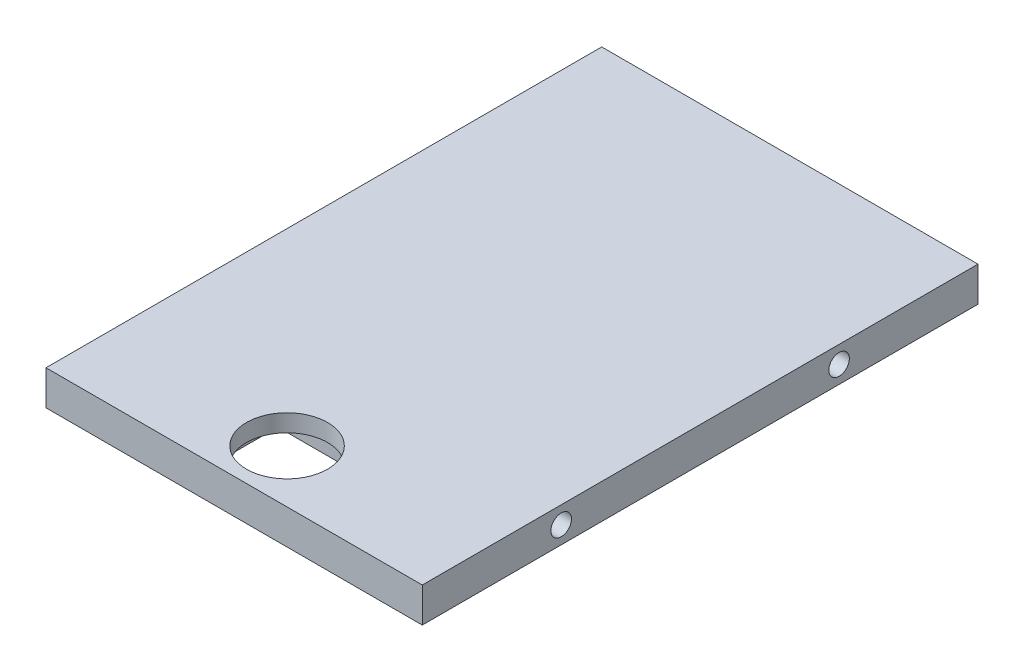
ISO-10303-21;
HEADER;
FILE_DESCRIPTION(('STEP AP214'),'2;1');
FILE_NAME('part.step','',(''),(''),'','','');
FILE_SCHEMA(('AUTOMOTIVE_DESIGN { 1 0 10303 214 1 1 1 1 }'));
ENDSEC;
DATA;
#1=APPLICATION_CONTEXT('core data for automotive mechanical design processes');
#2=APPLICATION_PROTOCOL_DEFINITION('international standard','automotive_design',2000,#1);
#3=PRODUCT_CONTEXT('',#1,'mechanical');
#4=PRODUCT('Part','Part','',(#3));
#5=PRODUCT_RELATED_PRODUCT_CATEGORY('part','',(#4));
#6=PRODUCT_DEFINITION_FORMATION('','',#4);
#7=PRODUCT_DEFINITION_CONTEXT('part definition',#1,'design');
#8=PRODUCT_DEFINITION('design','',#6,#7);
#9=PRODUCT_DEFINITION_SHAPE('','',#8);
#10=(LENGTH_UNIT() NAMED_UNIT(*) SI_UNIT(.MILLI.,.METRE.));
#11=(NAMED_UNIT(*) PLANE_ANGLE_UNIT() SI_UNIT($,.RADIAN.));
#12=(NAMED_UNIT(*) SI_UNIT($,.STERADIAN.) SOLID_ANGLE_UNIT());
#13=UNCERTAINTY_MEASURE_WITH_UNIT(LENGTH_MEASURE(1.E-05),#10,'distance_accuracy_value','');
#14=(GEOMETRIC_REPRESENTATION_CONTEXT(3) GLOBAL_UNCERTAINTY_ASSIGNED_CONTEXT((#13)) GLOBAL_UNIT_ASSIGNED_CONTEXT((#10,
#11,#12)) REPRESENTATION_CONTEXT('',''));
#15=CARTESIAN_POINT('',(0.,0.,0.));
#16=DIRECTION('',(0.,0.,1.));
#17=DIRECTION('',(1.,0.,0.));
#18=AXIS2_PLACEMENT_3D('',#15,#16,#17);
#19=CARTESIAN_POINT('',(0.,3.,0.));
#20=DIRECTION('',(1.,0.,0.));
#21=DIRECTION('',(0.,0.,-1.));
#22=AXIS2_PLACEMENT_3D('',#19,#20,#21);
#23=PLANE('',#22);
#24=CARTESIAN_POINT('',(0.,1.5,-36.));
#25=DIRECTION('',(-1.,0.,0.));
#26=DIRECTION('',(0.,0.,1.));
#27=AXIS2_PLACEMENT_3D('',#24,#25,#26);
#28=CIRCLE('',#27,0.889);
#29=CARTESIAN_POINT('',(0.,1.5,-35.111));
#30=VERTEX_POINT('',#29);
#31=EDGE_CURVE('E200',#30,#30,#28,.T.);
#32=ORIENTED_EDGE('',*,*,#31,.F.);
#33=EDGE_LOOP('',(#32));
#34=FACE_BOUND('',#33,.T.);
#35=CARTESIAN_POINT('',(0.,1.5,-12.));
#36=DIRECTION('',(-1.,0.,0.));
#37=DIRECTION('',(0.,0.,1.));
#38=AXIS2_PLACEMENT_3D('',#35,#36,#37);
#39=CIRCLE('',#38,0.889);
#40=CARTESIAN_POINT('',(0.,1.5,-11.111));
#41=VERTEX_POINT('',#40);
#42=EDGE_CURVE('E208',#41,#41,#39,.T.);
#43=ORIENTED_EDGE('',*,*,#42,.F.);
#44=EDGE_LOOP('',(#43));
#45=FACE_BOUND('',#44,.T.);
#46=DIRECTION('',(0.,0.,1.));
#47=VECTOR('',#46,1.);
#48=CARTESIAN_POINT('',(0.,0.,0.));
#49=LINE('',#48,#47);
#50=CARTESIAN_POINT('',(0.,0.,-48.));
#51=VERTEX_POINT('',#50);
#52=CARTESIAN_POINT('',(0.,0.,0.));
#53=VERTEX_POINT('',#52);
#54=EDGE_CURVE('E216',#51,#53,#49,.T.);
#55=ORIENTED_EDGE('',*,*,#54,.T.);
#56=DIRECTION('',(0.,-1.,0.));
#57=VECTOR('',#56,1.);
#58=CARTESIAN_POINT('',(0.,3.,0.));
#59=LINE('',#58,#57);
#60=CARTESIAN_POINT('',(0.,3.,0.));
#61=VERTEX_POINT('',#60);
#62=EDGE_CURVE('E11',#61,#53,#59,.T.);
#63=ORIENTED_EDGE('',*,*,#62,.F.);
#64=DIRECTION('',(0.,0.,1.));
#65=VECTOR('',#64,1.);
#66=CARTESIAN_POINT('',(0.,3.,0.));
#67=LINE('',#66,#65);
#68=CARTESIAN_POINT('',(0.,3.,-48.));
#69=VERTEX_POINT('',#68);
#70=EDGE_CURVE('E217',#69,#61,#67,.T.);
#71=ORIENTED_EDGE('',*,*,#70,.F.);
#72=DIRECTION('',(0.,-1.,0.));
#73=VECTOR('',#72,1.);
#74=CARTESIAN_POINT('',(0.,3.,-48.));
#75=LINE('',#74,#73);
#76=EDGE_CURVE('E227',#69,#51,#75,.T.);
#77=ORIENTED_EDGE('',*,*,#76,.T.);
#78=EDGE_LOOP('',(#55,#63,#71,#77));
#79=FACE_BOUND('',#78,.T.);
#80=ADVANCED_FACE('F45',(#34,#45,#79),#23,.F.);
#81=CARTESIAN_POINT('',(0.,3.,0.));
#82=DIRECTION('',(0.,0.,-1.));
#83=DIRECTION('',(-1.,0.,0.));
#84=AXIS2_PLACEMENT_3D('',#81,#82,#83);
#85=PLANE('',#84);
#86=DIRECTION('',(1.,0.,0.));
#87=VECTOR('',#86,1.);
#88=CARTESIAN_POINT('',(0.,0.,0.));
#89=LINE('',#88,#87);
#90=CARTESIAN_POINT('',(32.5,0.,0.));
#91=VERTEX_POINT('',#90);
#92=EDGE_CURVE('E231',#53,#91,#89,.T.);
#93=ORIENTED_EDGE('',*,*,#92,.T.);
#94=DIRECTION('',(0.,-1.,0.));
#95=VECTOR('',#94,1.);
#96=CARTESIAN_POINT('',(32.5,3.,0.));
#97=LINE('',#96,#95);
#98=CARTESIAN_POINT('',(32.5,3.,0.));
#99=VERTEX_POINT('',#98);
#100=EDGE_CURVE('E54',#99,#91,#97,.T.);
#101=ORIENTED_EDGE('',*,*,#100,.F.);
#102=DIRECTION('',(1.,0.,0.));
#103=VECTOR('',#102,1.);
#104=CARTESIAN_POINT('',(0.,3.,0.));
#105=LINE('',#104,#103);
#106=EDGE_CURVE('E98',#61,#99,#105,.T.);
#107=ORIENTED_EDGE('',*,*,#106,.F.);
#108=ORIENTED_EDGE('',*,*,#62,.T.);
#109=EDGE_LOOP('',(#93,#101,#107,#108));
#110=FACE_BOUND('',#109,.T.);
#111=ADVANCED_FACE('F267',(#110),#85,.F.);
#112=CARTESIAN_POINT('',(32.5,3.,0.));
#113=DIRECTION('',(-1.,0.,0.));
#114=DIRECTION('',(0.,0.,1.));
#115=AXIS2_PLACEMENT_3D('',#112,#113,#114);
#116=PLANE('',#115);
#117=CARTESIAN_POINT('',(32.5,1.5,-12.));
#118=DIRECTION('',(1.,0.,0.));
#119=DIRECTION('',(0.,0.,-1.));
#120=AXIS2_PLACEMENT_3D('',#117,#118,#119);
#121=CIRCLE('',#120,0.888999999999989);
#122=CARTESIAN_POINT('',(32.5,1.5,-12.889));
#123=VERTEX_POINT('',#122);
#124=EDGE_CURVE('E179',#123,#123,#121,.T.);
#125=ORIENTED_EDGE('',*,*,#124,.F.);
#126=EDGE_LOOP('',(#125));
#127=FACE_BOUND('',#126,.T.);
#128=CARTESIAN_POINT('',(32.5,1.5,-36.));
#129=DIRECTION('',(1.,0.,0.));
#130=DIRECTION('',(0.,0.,-1.));
#131=AXIS2_PLACEMENT_3D('',#128,#129,#130);
#132=CIRCLE('',#131,0.888999999999989);
#133=CARTESIAN_POINT('',(32.5,1.5,-36.889));
#134=VERTEX_POINT('',#133);
#135=EDGE_CURVE('E192',#134,#134,#132,.T.);
#136=ORIENTED_EDGE('',*,*,#135,.F.);
#137=EDGE_LOOP('',(#136));
#138=FACE_BOUND('',#137,.T.);
#139=DIRECTION('',(0.,0.,-1.));
#140=VECTOR('',#139,1.);
#141=CARTESIAN_POINT('',(32.5,0.,0.));
#142=LINE('',#141,#140);
#143=CARTESIAN_POINT('',(32.5,0.,-48.));
#144=VERTEX_POINT('',#143);
#145=EDGE_CURVE('E234',#91,#144,#142,.T.);
#146=ORIENTED_EDGE('',*,*,#145,.T.);
#147=DIRECTION('',(0.,-1.,0.));
#148=VECTOR('',#147,1.);
#149=CARTESIAN_POINT('',(32.5,3.,-48.));
#150=LINE('',#149,#148);
#151=CARTESIAN_POINT('',(32.5,3.,-48.));
#152=VERTEX_POINT('',#151);
#153=EDGE_CURVE('E241',#152,#144,#150,.T.);
#154=ORIENTED_EDGE('',*,*,#153,.F.);
#155=DIRECTION('',(0.,0.,-1.));
#156=VECTOR('',#155,1.);
#157=CARTESIAN_POINT('',(32.5,3.,0.));
#158=LINE('',#157,#156);
#159=EDGE_CURVE('E222',#99,#152,#158,.T.);
#160=ORIENTED_EDGE('',*,*,#159,.F.);
#161=ORIENTED_EDGE('',*,*,#100,.T.);
#162=EDGE_LOOP('',(#146,#154,#160,#161));
#163=FACE_BOUND('',#162,.T.);
#164=ADVANCED_FACE('F249',(#127,#138,#163),#116,.F.);
#165=CARTESIAN_POINT('',(0.,3.,-48.));
#166=DIRECTION('',(0.,0.,1.));
#167=DIRECTION('',(1.,0.,0.));
#168=AXIS2_PLACEMENT_3D('',#165,#166,#167);
#169=PLANE('',#168);
#170=DIRECTION('',(-1.,0.,0.));
#171=VECTOR('',#170,1.);
#172=CARTESIAN_POINT('',(0.,0.,-48.));
#173=LINE('',#172,#171);
#174=EDGE_CURVE('E91',#144,#51,#173,.T.);
#175=ORIENTED_EDGE('',*,*,#174,.T.);
#176=ORIENTED_EDGE('',*,*,#76,.F.);
#177=DIRECTION('',(-1.,0.,0.));
#178=VECTOR('',#177,1.);
#179=CARTESIAN_POINT('',(0.,3.,-48.));
#180=LINE('',#179,#178);
#181=EDGE_CURVE('E70',#152,#69,#180,.T.);
#182=ORIENTED_EDGE('',*,*,#181,.F.);
#183=ORIENTED_EDGE('',*,*,#153,.T.);
#184=EDGE_LOOP('',(#175,#176,#182,#183));
#185=FACE_BOUND('',#184,.T.);
#186=ADVANCED_FACE('F257',(#185),#169,.F.);
#187=CARTESIAN_POINT('',(0.,3.,0.));
#188=DIRECTION('',(0.,-1.,0.));
#189=DIRECTION('',(0.,0.,-1.));
#190=AXIS2_PLACEMENT_3D('',#187,#188,#189);
#191=PLANE('',#190);
#192=CARTESIAN_POINT('',(16.25,3.,-4.57));
#193=DIRECTION('',(0.,1.,0.));
#194=DIRECTION('',(0.,0.,1.));
#195=AXIS2_PLACEMENT_3D('',#192,#193,#194);
#196=CIRCLE('',#195,3.5);
#197=CARTESIAN_POINT('',(16.25,3.,-1.07));
#198=VERTEX_POINT('',#197);
#199=EDGE_CURVE('E160',#198,#198,#196,.T.);
#200=ORIENTED_EDGE('',*,*,#199,.F.);
#201=EDGE_LOOP('',(#200));
#202=FACE_BOUND('',#201,.T.);
#203=ORIENTED_EDGE('',*,*,#70,.T.);
#204=ORIENTED_EDGE('',*,*,#106,.T.);
#205=ORIENTED_EDGE('',*,*,#159,.T.);
#206=ORIENTED_EDGE('',*,*,#181,.T.);
#207=EDGE_LOOP('',(#203,#204,#205,#206));
#208=FACE_BOUND('',#207,.T.);
#209=ADVANCED_FACE('F259',(#202,#208),#191,.F.);
#210=CARTESIAN_POINT('',(0.,0.,0.));
#211=DIRECTION('',(0.,-1.,0.));
#212=DIRECTION('',(0.,0.,-1.));
#213=AXIS2_PLACEMENT_3D('',#210,#211,#212);
#214=PLANE('',#213);
#215=DIRECTION('',(0.,0.,1.));
#216=VECTOR('',#215,1.);
#217=CARTESIAN_POINT('',(21.05,0.,-4.57));
#218=LINE('',#217,#216);
#219=CARTESIAN_POINT('',(21.05,0.,-8.57));
#220=VERTEX_POINT('',#219);
#221=CARTESIAN_POINT('',(21.05,0.,-0.570000000000001));
#222=VERTEX_POINT('',#221);
#223=EDGE_CURVE('E136',#220,#222,#218,.T.);
#224=ORIENTED_EDGE('',*,*,#223,.F.);
#225=DIRECTION('',(1.,0.,0.));
#226=VECTOR('',#225,1.);
#227=CARTESIAN_POINT('',(21.05,0.,-8.57));
#228=LINE('',#227,#226);
#229=CARTESIAN_POINT('',(11.45,0.,-8.57));
#230=VERTEX_POINT('',#229);
#231=EDGE_CURVE('E157',#230,#220,#228,.T.);
#232=ORIENTED_EDGE('',*,*,#231,.F.);
#233=DIRECTION('',(0.,0.,-1.));
#234=VECTOR('',#233,1.);
#235=CARTESIAN_POINT('',(11.45,0.,-8.57));
#236=LINE('',#235,#234);
#237=CARTESIAN_POINT('',(11.45,0.,-0.570000000000001));
#238=VERTEX_POINT('',#237);
#239=EDGE_CURVE('E169',#238,#230,#236,.T.);
#240=ORIENTED_EDGE('',*,*,#239,.F.);
#241=DIRECTION('',(-1.,0.,0.));
#242=VECTOR('',#241,1.);
#243=CARTESIAN_POINT('',(11.45,0.,-0.570000000000001));
#244=LINE('',#243,#242);
#245=EDGE_CURVE('E166',#222,#238,#244,.T.);
#246=ORIENTED_EDGE('',*,*,#245,.F.);
#247=EDGE_LOOP('',(#224,#232,#240,#246));
#248=FACE_BOUND('',#247,.T.);
#249=ORIENTED_EDGE('',*,*,#54,.F.);
#250=ORIENTED_EDGE('',*,*,#174,.F.);
#251=ORIENTED_EDGE('',*,*,#145,.F.);
#252=ORIENTED_EDGE('',*,*,#92,.F.);
#253=EDGE_LOOP('',(#249,#250,#251,#252));
#254=FACE_BOUND('',#253,.T.);
#255=ADVANCED_FACE('F253',(#248,#254),#214,.T.);
#256=CARTESIAN_POINT('',(7.4658349096845,1.5,-12.));
#257=DIRECTION('',(-1.,0.,0.));
#258=DIRECTION('',(0.,0.,1.));
#259=AXIS2_PLACEMENT_3D('',#256,#257,#258);
#260=CONICAL_SURFACE('',#259,0.888999999999998,1.02974425867665);
#261=CARTESIAN_POINT('',(8.,1.5,-12.));
#262=VERTEX_POINT('',#261);
#263=VERTEX_LOOP('',#262);
#264=FACE_BOUND('',#263,.T.);
#265=CARTESIAN_POINT('',(7.4658349096845,1.5,-12.));
#266=DIRECTION('',(-1.,0.,0.));
#267=DIRECTION('',(0.,0.,1.));
#268=AXIS2_PLACEMENT_3D('',#265,#266,#267);
#269=CIRCLE('',#268,0.888999999999998);
#270=CARTESIAN_POINT('',(7.4658349096845,1.5,-11.111));
#271=VERTEX_POINT('',#270);
#272=EDGE_CURVE('E212',#271,#271,#269,.T.);
#273=ORIENTED_EDGE('',*,*,#272,.T.);
#274=EDGE_LOOP('',(#273));
#275=FACE_BOUND('',#274,.T.);
#276=ADVANCED_FACE('F283',(#264,#275),#260,.F.);
#277=CARTESIAN_POINT('',(0.,1.5,-12.));
#278=DIRECTION('',(-1.,0.,0.));
#279=DIRECTION('',(0.,0.,1.));
#280=AXIS2_PLACEMENT_3D('',#277,#278,#279);
#281=CYLINDRICAL_SURFACE('',#280,0.888999999999999);
#282=ORIENTED_EDGE('',*,*,#272,.F.);
#283=EDGE_LOOP('',(#282));
#284=FACE_BOUND('',#283,.T.);
#285=ORIENTED_EDGE('',*,*,#42,.T.);
#286=EDGE_LOOP('',(#285));
#287=FACE_BOUND('',#286,.T.);
#288=ADVANCED_FACE('F280',(#284,#287),#281,.F.);
#289=CARTESIAN_POINT('',(7.4658349096845,1.5,-36.));
#290=DIRECTION('',(-1.,0.,0.));
#291=DIRECTION('',(0.,0.,1.));
#292=AXIS2_PLACEMENT_3D('',#289,#290,#291);
#293=CONICAL_SURFACE('',#292,0.888999999999998,1.02974425867665);
#294=CARTESIAN_POINT('',(8.,1.5,-36.));
#295=VERTEX_POINT('',#294);
#296=VERTEX_LOOP('',#295);
#297=FACE_BOUND('',#296,.T.);
#298=CARTESIAN_POINT('',(7.4658349096845,1.5,-36.));
#299=DIRECTION('',(-1.,0.,0.));
#300=DIRECTION('',(0.,0.,1.));
#301=AXIS2_PLACEMENT_3D('',#298,#299,#300);
#302=CIRCLE('',#301,0.888999999999998);
#303=CARTESIAN_POINT('',(7.4658349096845,1.5,-35.111));
#304=VERTEX_POINT('',#303);
#305=EDGE_CURVE('E204',#304,#304,#302,.T.);
#306=ORIENTED_EDGE('',*,*,#305,.T.);
#307=EDGE_LOOP('',(#306));
#308=FACE_BOUND('',#307,.T.);
#309=ADVANCED_FACE('F282',(#297,#308),#293,.F.);
#310=CARTESIAN_POINT('',(0.,1.5,-36.));
#311=DIRECTION('',(-1.,0.,0.));
#312=DIRECTION('',(0.,0.,1.));
#313=AXIS2_PLACEMENT_3D('',#310,#311,#312);
#314=CYLINDRICAL_SURFACE('',#313,0.888999999999999);
#315=ORIENTED_EDGE('',*,*,#305,.F.);
#316=EDGE_LOOP('',(#315));
#317=FACE_BOUND('',#316,.T.);
#318=ORIENTED_EDGE('',*,*,#31,.T.);
#319=EDGE_LOOP('',(#318));
#320=FACE_BOUND('',#319,.T.);
#321=ADVANCED_FACE('F290',(#317,#320),#314,.F.);
#322=CARTESIAN_POINT('',(25.0341650903155,1.5,-36.));
#323=DIRECTION('',(1.,0.,0.));
#324=DIRECTION('',(0.,0.,-1.));
#325=AXIS2_PLACEMENT_3D('',#322,#323,#324);
#326=CONICAL_SURFACE('',#325,0.888999999999998,1.02974425867665);
#327=CARTESIAN_POINT('',(24.5,1.5,-36.));
#328=VERTEX_POINT('',#327);
#329=VERTEX_LOOP('',#328);
#330=FACE_BOUND('',#329,.T.);
#331=CARTESIAN_POINT('',(25.0341650903155,1.5,-36.));
#332=DIRECTION('',(1.,0.,0.));
#333=DIRECTION('',(0.,0.,-1.));
#334=AXIS2_PLACEMENT_3D('',#331,#332,#333);
#335=CIRCLE('',#334,0.888999999999998);
#336=CARTESIAN_POINT('',(25.0341650903155,1.5,-36.889));
#337=VERTEX_POINT('',#336);
#338=EDGE_CURVE('E196',#337,#337,#335,.T.);
#339=ORIENTED_EDGE('',*,*,#338,.T.);
#340=EDGE_LOOP('',(#339));
#341=FACE_BOUND('',#340,.T.);
#342=ADVANCED_FACE('F330',(#330,#341),#326,.F.);
#343=CARTESIAN_POINT('',(32.5,1.5,-36.));
#344=DIRECTION('',(1.,0.,0.));
#345=DIRECTION('',(0.,0.,-1.));
#346=AXIS2_PLACEMENT_3D('',#343,#344,#345);
#347=CYLINDRICAL_SURFACE('',#346,0.888999999999994);
#348=ORIENTED_EDGE('',*,*,#338,.F.);
#349=EDGE_LOOP('',(#348));
#350=FACE_BOUND('',#349,.T.);
#351=ORIENTED_EDGE('',*,*,#135,.T.);
#352=EDGE_LOOP('',(#351));
#353=FACE_BOUND('',#352,.T.);
#354=ADVANCED_FACE('F326',(#350,#353),#347,.F.);
#355=CARTESIAN_POINT('',(25.0341650903155,1.5,-12.));
#356=DIRECTION('',(1.,0.,0.));
#357=DIRECTION('',(0.,0.,-1.));
#358=AXIS2_PLACEMENT_3D('',#355,#356,#357);
#359=CONICAL_SURFACE('',#358,0.888999999999998,1.02974425867665);
#360=CARTESIAN_POINT('',(24.5,1.5,-12.));
#361=VERTEX_POINT('',#360);
#362=VERTEX_LOOP('',#361);
#363=FACE_BOUND('',#362,.T.);
#364=CARTESIAN_POINT('',(25.0341650903155,1.5,-12.));
#365=DIRECTION('',(1.,0.,0.));
#366=DIRECTION('',(0.,0.,-1.));
#367=AXIS2_PLACEMENT_3D('',#364,#365,#366);
#368=CIRCLE('',#367,0.888999999999998);
#369=CARTESIAN_POINT('',(25.0341650903155,1.5,-12.889));
#370=VERTEX_POINT('',#369);
#371=EDGE_CURVE('E188',#370,#370,#368,.T.);
#372=ORIENTED_EDGE('',*,*,#371,.T.);
#373=EDGE_LOOP('',(#372));
#374=FACE_BOUND('',#373,.T.);
#375=ADVANCED_FACE('F322',(#363,#374),#359,.F.);
#376=CARTESIAN_POINT('',(32.5,1.5,-12.));
#377=DIRECTION('',(1.,0.,0.));
#378=DIRECTION('',(0.,0.,-1.));
#379=AXIS2_PLACEMENT_3D('',#376,#377,#378);
#380=CYLINDRICAL_SURFACE('',#379,0.888999999999994);
#381=ORIENTED_EDGE('',*,*,#371,.F.);
#382=EDGE_LOOP('',(#381));
#383=FACE_BOUND('',#382,.T.);
#384=ORIENTED_EDGE('',*,*,#124,.T.);
#385=EDGE_LOOP('',(#384));
#386=FACE_BOUND('',#385,.T.);
#387=ADVANCED_FACE('F314',(#383,#386),#380,.F.);
#388=CARTESIAN_POINT('',(21.05,1.5,-4.57));
#389=DIRECTION('',(1.,0.,0.));
#390=DIRECTION('',(0.,0.,-1.));
#391=AXIS2_PLACEMENT_3D('',#388,#389,#390);
#392=PLANE('',#391);
#393=ORIENTED_EDGE('',*,*,#223,.T.);
#394=DIRECTION('',(0.,-1.,0.));
#395=VECTOR('',#394,1.);
#396=CARTESIAN_POINT('',(21.05,1.5,-0.570000000000001));
#397=LINE('',#396,#395);
#398=CARTESIAN_POINT('',(21.05,1.5,-0.570000000000001));
#399=VERTEX_POINT('',#398);
#400=EDGE_CURVE('E61',#399,#222,#397,.T.);
#401=ORIENTED_EDGE('',*,*,#400,.F.);
#402=DIRECTION('',(0.,0.,1.));
#403=VECTOR('',#402,1.);
#404=CARTESIAN_POINT('',(21.05,1.5,-0.570000000000001));
#405=LINE('',#404,#403);
#406=CARTESIAN_POINT('',(21.05,1.5,-8.57));
#407=VERTEX_POINT('',#406);
#408=EDGE_CURVE('E133',#407,#399,#405,.T.);
#409=ORIENTED_EDGE('',*,*,#408,.F.);
#410=DIRECTION('',(0.,-1.,0.));
#411=VECTOR('',#410,1.);
#412=CARTESIAN_POINT('',(21.05,1.5,-8.57));
#413=LINE('',#412,#411);
#414=EDGE_CURVE('E176',#407,#220,#413,.T.);
#415=ORIENTED_EDGE('',*,*,#414,.T.);
#416=EDGE_LOOP('',(#393,#401,#409,#415));
#417=FACE_BOUND('',#416,.T.);
#418=ADVANCED_FACE('F131',(#417),#392,.F.);
#419=CARTESIAN_POINT('',(21.05,1.5,-8.57));
#420=DIRECTION('',(0.,0.,-1.));
#421=DIRECTION('',(-1.,0.,0.));
#422=AXIS2_PLACEMENT_3D('',#419,#420,#421);
#423=PLANE('',#422);
#424=ORIENTED_EDGE('',*,*,#231,.T.);
#425=ORIENTED_EDGE('',*,*,#414,.F.);
#426=DIRECTION('',(1.,0.,0.));
#427=VECTOR('',#426,1.);
#428=CARTESIAN_POINT('',(21.05,1.5,-8.57));
#429=LINE('',#428,#427);
#430=CARTESIAN_POINT('',(11.45,1.5,-8.57));
#431=VERTEX_POINT('',#430);
#432=EDGE_CURVE('E140',#431,#407,#429,.T.);
#433=ORIENTED_EDGE('',*,*,#432,.F.);
#434=DIRECTION('',(0.,-1.,0.));
#435=VECTOR('',#434,1.);
#436=CARTESIAN_POINT('',(11.45,1.5,-8.57));
#437=LINE('',#436,#435);
#438=EDGE_CURVE('E180',#431,#230,#437,.T.);
#439=ORIENTED_EDGE('',*,*,#438,.T.);
#440=EDGE_LOOP('',(#424,#425,#433,#439));
#441=FACE_BOUND('',#440,.T.);
#442=ADVANCED_FACE('F306',(#441),#423,.F.);
#443=CARTESIAN_POINT('',(11.45,1.5,-8.57));
#444=DIRECTION('',(-1.,0.,0.));
#445=DIRECTION('',(0.,0.,1.));
#446=AXIS2_PLACEMENT_3D('',#443,#444,#445);
#447=PLANE('',#446);
#448=ORIENTED_EDGE('',*,*,#239,.T.);
#449=ORIENTED_EDGE('',*,*,#438,.F.);
#450=DIRECTION('',(0.,0.,-1.));
#451=VECTOR('',#450,1.);
#452=CARTESIAN_POINT('',(11.45,1.5,-8.57));
#453=LINE('',#452,#451);
#454=CARTESIAN_POINT('',(11.45,1.5,-0.570000000000001));
#455=VERTEX_POINT('',#454);
#456=EDGE_CURVE('E149',#455,#431,#453,.T.);
#457=ORIENTED_EDGE('',*,*,#456,.F.);
#458=DIRECTION('',(0.,-1.,0.));
#459=VECTOR('',#458,1.);
#460=CARTESIAN_POINT('',(11.45,1.5,-0.570000000000001));
#461=LINE('',#460,#459);
#462=EDGE_CURVE('E139',#455,#238,#461,.T.);
#463=ORIENTED_EDGE('',*,*,#462,.T.);
#464=EDGE_LOOP('',(#448,#449,#457,#463));
#465=FACE_BOUND('',#464,.T.);
#466=ADVANCED_FACE('F304',(#465),#447,.F.);
#467=CARTESIAN_POINT('',(11.45,1.5,-0.570000000000001));
#468=DIRECTION('',(0.,0.,1.));
#469=DIRECTION('',(1.,0.,0.));
#470=AXIS2_PLACEMENT_3D('',#467,#468,#469);
#471=PLANE('',#470);
#472=ORIENTED_EDGE('',*,*,#245,.T.);
#473=ORIENTED_EDGE('',*,*,#462,.F.);
#474=DIRECTION('',(-1.,0.,0.));
#475=VECTOR('',#474,1.);
#476=CARTESIAN_POINT('',(11.45,1.5,-0.570000000000001));
#477=LINE('',#476,#475);
#478=EDGE_CURVE('E143',#399,#455,#477,.T.);
#479=ORIENTED_EDGE('',*,*,#478,.F.);
#480=ORIENTED_EDGE('',*,*,#400,.T.);
#481=EDGE_LOOP('',(#472,#473,#479,#480));
#482=FACE_BOUND('',#481,.T.);
#483=ADVANCED_FACE('F144',(#482),#471,.F.);
#484=CARTESIAN_POINT('',(0.,1.5,0.));
#485=DIRECTION('',(0.,1.,0.));
#486=DIRECTION('',(0.,0.,1.));
#487=AXIS2_PLACEMENT_3D('',#484,#485,#486);
#488=PLANE('',#487);
#489=CARTESIAN_POINT('',(16.25,1.5,-4.57));
#490=DIRECTION('',(0.,1.,0.));
#491=DIRECTION('',(0.,0.,1.));
#492=AXIS2_PLACEMENT_3D('',#489,#490,#491);
#493=CIRCLE('',#492,3.5);
#494=CARTESIAN_POINT('',(16.25,1.5,-1.07));
#495=VERTEX_POINT('',#494);
#496=EDGE_CURVE('E48',#495,#495,#493,.T.);
#497=ORIENTED_EDGE('',*,*,#496,.T.);
#498=EDGE_LOOP('',(#497));
#499=FACE_BOUND('',#498,.T.);
#500=ORIENTED_EDGE('',*,*,#408,.T.);
#501=ORIENTED_EDGE('',*,*,#478,.T.);
#502=ORIENTED_EDGE('',*,*,#456,.T.);
#503=ORIENTED_EDGE('',*,*,#432,.T.);
#504=EDGE_LOOP('',(#500,#501,#502,#503));
#505=FACE_BOUND('',#504,.T.);
#506=ADVANCED_FACE('F152',(#499,#505),#488,.F.);
#507=CARTESIAN_POINT('',(16.25,0.,-4.57));
#508=DIRECTION('',(0.,1.,0.));
#509=DIRECTION('',(0.,0.,1.));
#510=AXIS2_PLACEMENT_3D('',#507,#508,#509);
#511=CYLINDRICAL_SURFACE('',#510,3.5);
#512=ORIENTED_EDGE('',*,*,#199,.T.);
#513=EDGE_LOOP('',(#512));
#514=FACE_BOUND('',#513,.T.);
#515=ORIENTED_EDGE('',*,*,#496,.F.);
#516=EDGE_LOOP('',(#515));
#517=FACE_BOUND('',#516,.T.);
#518=ADVANCED_FACE('F402',(#514,#517),#511,.F.);
#519=CLOSED_SHELL('',(#80,#111,#164,#186,#209,#255,#276,#288,#309,#321,#342,#354,#375,#387,#418,
#442,#466,#483,#506,#518));
#520=MANIFOLD_SOLID_BREP('B2',#519);
#521=ADVANCED_BREP_SHAPE_REPRESENTATION('',(#18,#520),#14);
#522=SHAPE_DEFINITION_REPRESENTATION(#9,#521);
ENDSEC;
END-ISO-10303-21;
